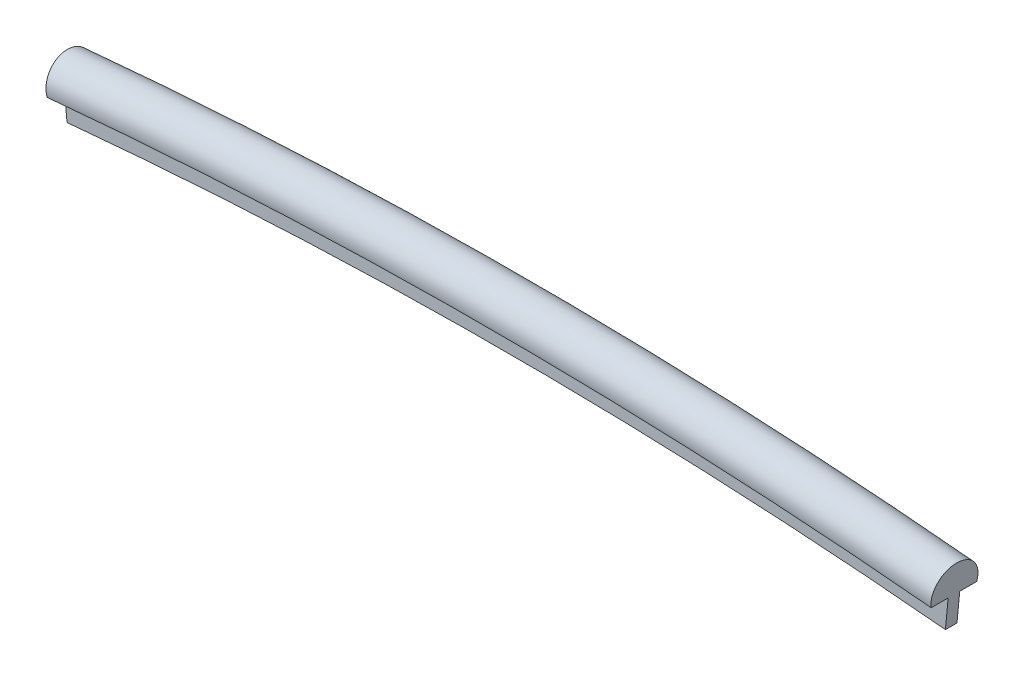
ISO-10303-21;
HEADER;
FILE_DESCRIPTION(('STEP AP214'),'2;1');
FILE_NAME('part.step','',(''),(''),'','','');
FILE_SCHEMA(('AUTOMOTIVE_DESIGN { 1 0 10303 214 1 1 1 1 }'));
ENDSEC;
DATA;
#1=APPLICATION_CONTEXT('core data for automotive mechanical design processes');
#2=APPLICATION_PROTOCOL_DEFINITION('international standard','automotive_design',2000,#1);
#3=PRODUCT_CONTEXT('',#1,'mechanical');
#4=PRODUCT('Part','Part','',(#3));
#5=PRODUCT_RELATED_PRODUCT_CATEGORY('part','',(#4));
#6=PRODUCT_DEFINITION_FORMATION('','',#4);
#7=PRODUCT_DEFINITION_CONTEXT('part definition',#1,'design');
#8=PRODUCT_DEFINITION('design','',#6,#7);
#9=PRODUCT_DEFINITION_SHAPE('','',#8);
#10=(LENGTH_UNIT() NAMED_UNIT(*) SI_UNIT(.MILLI.,.METRE.));
#11=(NAMED_UNIT(*) PLANE_ANGLE_UNIT() SI_UNIT($,.RADIAN.));
#12=(NAMED_UNIT(*) SI_UNIT($,.STERADIAN.) SOLID_ANGLE_UNIT());
#13=UNCERTAINTY_MEASURE_WITH_UNIT(LENGTH_MEASURE(1.E-05),#10,'distance_accuracy_value','');
#14=(GEOMETRIC_REPRESENTATION_CONTEXT(3) GLOBAL_UNCERTAINTY_ASSIGNED_CONTEXT((#13)) GLOBAL_UNIT_ASSIGNED_CONTEXT((#10,
#11,#12)) REPRESENTATION_CONTEXT('',''));
#15=CARTESIAN_POINT('',(0.,0.,0.));
#16=DIRECTION('',(0.,0.,1.));
#17=DIRECTION('',(1.,0.,0.));
#18=AXIS2_PLACEMENT_3D('',#15,#16,#17);
#19=CARTESIAN_POINT('',(0.,0.,70.5976415970385));
#20=DIRECTION('',(0.,0.,1.));
#21=DIRECTION('',(1.,0.,0.));
#22=AXIS2_PLACEMENT_3D('',#19,#20,#21);
#23=CYLINDRICAL_SURFACE('',#22,241.3);
#24=CARTESIAN_POINT('',(0.,0.,1.18));
#25=DIRECTION('',(0.,0.,1.));
#26=DIRECTION('',(1.,0.,0.));
#27=AXIS2_PLACEMENT_3D('',#24,#25,#26);
#28=CIRCLE('',#27,241.3);
#29=CARTESIAN_POINT('',(22.885569844404,240.21228256044,1.18));
#30=VERTEX_POINT('',#29);
#31=CARTESIAN_POINT('',(-22.885569844404,240.21228256044,1.18));
#32=VERTEX_POINT('',#31);
#33=EDGE_CURVE('E11',#30,#32,#28,.T.);
#34=ORIENTED_EDGE('',*,*,#33,.T.);
#35=DIRECTION('',(0.,0.,-1.));
#36=VECTOR('',#35,1.);
#37=CARTESIAN_POINT('',(-22.885569844404,240.21228256044,1.18));
#38=LINE('',#37,#36);
#39=CARTESIAN_POINT('',(-22.885569844404,240.21228256044,0.3));
#40=VERTEX_POINT('',#39);
#41=EDGE_CURVE('E103',#32,#40,#38,.T.);
#42=ORIENTED_EDGE('',*,*,#41,.T.);
#43=CARTESIAN_POINT('',(0.,0.,0.299999999999995));
#44=DIRECTION('',(0.,0.,1.));
#45=DIRECTION('',(1.,0.,0.));
#46=AXIS2_PLACEMENT_3D('',#43,#44,#45);
#47=CIRCLE('',#46,241.3);
#48=CARTESIAN_POINT('',(22.885569844404,240.21228256044,0.3));
#49=VERTEX_POINT('',#48);
#50=EDGE_CURVE('E85',#49,#40,#47,.T.);
#51=ORIENTED_EDGE('',*,*,#50,.F.);
#52=DIRECTION('',(0.,0.,-1.));
#53=VECTOR('',#52,1.);
#54=CARTESIAN_POINT('',(22.885569844404,240.21228256044,1.18));
#55=LINE('',#54,#53);
#56=EDGE_CURVE('E117',#30,#49,#55,.T.);
#57=ORIENTED_EDGE('',*,*,#56,.F.);
#58=EDGE_LOOP('',(#34,#42,#51,#57));
#59=FACE_BOUND('',#58,.T.);
#60=ADVANCED_FACE('F33',(#59),#23,.F.);
#61=CARTESIAN_POINT('',(0.,0.,0.));
#62=DIRECTION('',(0.,0.,1.));
#63=DIRECTION('',(1.,0.,0.));
#64=AXIS2_PLACEMENT_3D('',#61,#62,#63);
#65=TOROIDAL_SURFACE('',#64,241.586013989906,1.21416802890791);
#66=CARTESIAN_POINT('',(0.,0.,-1.18));
#67=DIRECTION('',(0.,0.,1.));
#68=DIRECTION('',(1.,0.,0.));
#69=AXIS2_PLACEMENT_3D('',#66,#67,#68);
#70=CIRCLE('',#69,241.3);
#71=CARTESIAN_POINT('',(22.885569844404,240.21228256044,-1.18));
#72=VERTEX_POINT('',#71);
#73=CARTESIAN_POINT('',(-22.885569844404,240.21228256044,-1.18));
#74=VERTEX_POINT('',#73);
#75=EDGE_CURVE('E41',#72,#74,#70,.T.);
#76=ORIENTED_EDGE('',*,*,#75,.T.);
#77=CARTESIAN_POINT('',(-22.9126962146588,240.497007273908,0.));
#78=DIRECTION('',(0.995492260921842,0.0948428091355327,0.));
#79=DIRECTION('',(0.,0.,1.));
#80=AXIS2_PLACEMENT_3D('',#77,#78,#79);
#81=CIRCLE('',#80,1.21416802890791);
#82=EDGE_CURVE('E115',#74,#32,#81,.T.);
#83=ORIENTED_EDGE('',*,*,#82,.T.);
#84=ORIENTED_EDGE('',*,*,#33,.F.);
#85=CARTESIAN_POINT('',(22.9126962146588,240.497007273908,0.));
#86=DIRECTION('',(0.995492260921842,-0.0948428091355327,0.));
#87=DIRECTION('',(0.,0.,1.));
#88=AXIS2_PLACEMENT_3D('',#85,#86,#87);
#89=CIRCLE('',#88,1.21416802890791);
#90=EDGE_CURVE('E97',#72,#30,#89,.T.);
#91=ORIENTED_EDGE('',*,*,#90,.F.);
#92=EDGE_LOOP('',(#76,#83,#84,#91));
#93=FACE_BOUND('',#92,.T.);
#94=ADVANCED_FACE('F35',(#93),#65,.T.);
#95=CARTESIAN_POINT('',(0.,0.,70.5976415970385));
#96=DIRECTION('',(0.,0.,1.));
#97=DIRECTION('',(1.,0.,0.));
#98=AXIS2_PLACEMENT_3D('',#95,#96,#97);
#99=CYLINDRICAL_SURFACE('',#98,241.3);
#100=CARTESIAN_POINT('',(0.,0.,-0.299999999999995));
#101=DIRECTION('',(0.,0.,1.));
#102=DIRECTION('',(1.,0.,0.));
#103=AXIS2_PLACEMENT_3D('',#100,#101,#102);
#104=CIRCLE('',#103,241.3);
#105=CARTESIAN_POINT('',(22.885569844404,240.21228256044,-0.3));
#106=VERTEX_POINT('',#105);
#107=CARTESIAN_POINT('',(-22.885569844404,240.21228256044,-0.3));
#108=VERTEX_POINT('',#107);
#109=EDGE_CURVE('E132',#106,#108,#104,.T.);
#110=ORIENTED_EDGE('',*,*,#109,.T.);
#111=DIRECTION('',(0.,0.,-1.));
#112=VECTOR('',#111,1.);
#113=CARTESIAN_POINT('',(-22.885569844404,240.21228256044,-0.3));
#114=LINE('',#113,#112);
#115=EDGE_CURVE('E113',#108,#74,#114,.T.);
#116=ORIENTED_EDGE('',*,*,#115,.T.);
#117=ORIENTED_EDGE('',*,*,#75,.F.);
#118=DIRECTION('',(0.,0.,-1.));
#119=VECTOR('',#118,1.);
#120=CARTESIAN_POINT('',(22.885569844404,240.21228256044,-0.3));
#121=LINE('',#120,#119);
#122=EDGE_CURVE('E125',#106,#72,#121,.T.);
#123=ORIENTED_EDGE('',*,*,#122,.F.);
#124=EDGE_LOOP('',(#110,#116,#117,#123));
#125=FACE_BOUND('',#124,.T.);
#126=ADVANCED_FACE('F134',(#125),#99,.F.);
#127=CARTESIAN_POINT('',(22.7433056307007,238.719044169058,-0.3));
#128=DIRECTION('',(0.,0.,1.));
#129=DIRECTION('',(1.,0.,0.));
#130=AXIS2_PLACEMENT_3D('',#127,#128,#129);
#131=PLANE('',#130);
#132=CARTESIAN_POINT('',(0.,0.,-0.299999999999995));
#133=DIRECTION('',(0.,0.,1.));
#134=DIRECTION('',(1.,0.,0.));
#135=AXIS2_PLACEMENT_3D('',#132,#133,#134);
#136=CIRCLE('',#135,239.8);
#137=CARTESIAN_POINT('',(22.7433056307007,238.719044169058,-0.3));
#138=VERTEX_POINT('',#137);
#139=CARTESIAN_POINT('',(-22.7433056307007,238.719044169058,-0.3));
#140=VERTEX_POINT('',#139);
#141=EDGE_CURVE('E129',#138,#140,#136,.T.);
#142=ORIENTED_EDGE('',*,*,#141,.T.);
#143=DIRECTION('',(-0.0948428091355327,0.995492260921842,0.));
#144=VECTOR('',#143,1.);
#145=CARTESIAN_POINT('',(-22.7433056307007,238.719044169058,-0.3));
#146=LINE('',#145,#144);
#147=EDGE_CURVE('E110',#140,#108,#146,.T.);
#148=ORIENTED_EDGE('',*,*,#147,.T.);
#149=ORIENTED_EDGE('',*,*,#109,.F.);
#150=DIRECTION('',(0.0948428091355327,0.995492260921842,0.));
#151=VECTOR('',#150,1.);
#152=CARTESIAN_POINT('',(22.7433056307007,238.719044169058,-0.3));
#153=LINE('',#152,#151);
#154=EDGE_CURVE('E122',#138,#106,#153,.T.);
#155=ORIENTED_EDGE('',*,*,#154,.F.);
#156=EDGE_LOOP('',(#142,#148,#149,#155));
#157=FACE_BOUND('',#156,.T.);
#158=ADVANCED_FACE('F136',(#157),#131,.F.);
#159=CARTESIAN_POINT('',(0.,0.,70.5976415970385));
#160=DIRECTION('',(0.,0.,1.));
#161=DIRECTION('',(1.,0.,0.));
#162=AXIS2_PLACEMENT_3D('',#159,#160,#161);
#163=CYLINDRICAL_SURFACE('',#162,239.8);
#164=CARTESIAN_POINT('',(0.,0.,0.299999999999995));
#165=DIRECTION('',(0.,0.,1.));
#166=DIRECTION('',(1.,0.,0.));
#167=AXIS2_PLACEMENT_3D('',#164,#165,#166);
#168=CIRCLE('',#167,239.8);
#169=CARTESIAN_POINT('',(22.7433056307007,238.719044169058,0.3));
#170=VERTEX_POINT('',#169);
#171=CARTESIAN_POINT('',(-22.7433056307007,238.719044169058,0.3));
#172=VERTEX_POINT('',#171);
#173=EDGE_CURVE('E96',#170,#172,#168,.T.);
#174=ORIENTED_EDGE('',*,*,#173,.T.);
#175=DIRECTION('',(0.,0.,-1.));
#176=VECTOR('',#175,1.);
#177=CARTESIAN_POINT('',(-22.7433056307007,238.719044169058,0.));
#178=LINE('',#177,#176);
#179=EDGE_CURVE('E105',#172,#140,#178,.T.);
#180=ORIENTED_EDGE('',*,*,#179,.T.);
#181=ORIENTED_EDGE('',*,*,#141,.F.);
#182=DIRECTION('',(0.,0.,-1.));
#183=VECTOR('',#182,1.);
#184=CARTESIAN_POINT('',(22.7433056307007,238.719044169058,0.));
#185=LINE('',#184,#183);
#186=EDGE_CURVE('E120',#170,#138,#185,.T.);
#187=ORIENTED_EDGE('',*,*,#186,.F.);
#188=EDGE_LOOP('',(#174,#180,#181,#187));
#189=FACE_BOUND('',#188,.T.);
#190=ADVANCED_FACE('F141',(#189),#163,.F.);
#191=CARTESIAN_POINT('',(22.7433056307007,238.719044169058,0.3));
#192=DIRECTION('',(0.,0.,-1.));
#193=DIRECTION('',(-1.,0.,0.));
#194=AXIS2_PLACEMENT_3D('',#191,#192,#193);
#195=PLANE('',#194);
#196=DIRECTION('',(-0.0948428091355327,-0.995492260921842,0.));
#197=VECTOR('',#196,1.);
#198=CARTESIAN_POINT('',(22.7433056307007,238.719044169058,0.3));
#199=LINE('',#198,#197);
#200=EDGE_CURVE('E91',#49,#170,#199,.T.);
#201=ORIENTED_EDGE('',*,*,#200,.F.);
#202=ORIENTED_EDGE('',*,*,#50,.T.);
#203=DIRECTION('',(0.0948428091355327,-0.995492260921842,0.));
#204=VECTOR('',#203,1.);
#205=CARTESIAN_POINT('',(-22.7433056307007,238.719044169058,0.3));
#206=LINE('',#205,#204);
#207=EDGE_CURVE('E88',#40,#172,#206,.T.);
#208=ORIENTED_EDGE('',*,*,#207,.T.);
#209=ORIENTED_EDGE('',*,*,#173,.F.);
#210=EDGE_LOOP('',(#201,#202,#208,#209));
#211=FACE_BOUND('',#210,.T.);
#212=ADVANCED_FACE('F87',(#211),#195,.F.);
#213=CARTESIAN_POINT('',(22.9126962146588,240.497007273908,0.));
#214=DIRECTION('',(-0.995492260921842,0.0948428091355327,0.));
#215=DIRECTION('',(0.,0.,1.));
#216=AXIS2_PLACEMENT_3D('',#213,#214,#215);
#217=PLANE('',#216);
#218=ORIENTED_EDGE('',*,*,#56,.T.);
#219=ORIENTED_EDGE('',*,*,#200,.T.);
#220=ORIENTED_EDGE('',*,*,#186,.T.);
#221=ORIENTED_EDGE('',*,*,#154,.T.);
#222=ORIENTED_EDGE('',*,*,#122,.T.);
#223=ORIENTED_EDGE('',*,*,#90,.T.);
#224=EDGE_LOOP('',(#218,#219,#220,#221,#222,#223));
#225=FACE_BOUND('',#224,.T.);
#226=ADVANCED_FACE('F143',(#225),#217,.F.);
#227=CARTESIAN_POINT('',(-22.9126962146588,240.497007273908,0.));
#228=DIRECTION('',(-0.995492260921842,-0.0948428091355327,0.));
#229=DIRECTION('',(0.,0.,1.));
#230=AXIS2_PLACEMENT_3D('',#227,#228,#229);
#231=PLANE('',#230);
#232=ORIENTED_EDGE('',*,*,#41,.F.);
#233=ORIENTED_EDGE('',*,*,#82,.F.);
#234=ORIENTED_EDGE('',*,*,#115,.F.);
#235=ORIENTED_EDGE('',*,*,#147,.F.);
#236=ORIENTED_EDGE('',*,*,#179,.F.);
#237=ORIENTED_EDGE('',*,*,#207,.F.);
#238=EDGE_LOOP('',(#232,#233,#234,#235,#236,#237));
#239=FACE_BOUND('',#238,.T.);
#240=ADVANCED_FACE('F101',(#239),#231,.T.);
#241=CLOSED_SHELL('',(#60,#94,#126,#158,#190,#212,#226,#240));
#242=MANIFOLD_SOLID_BREP('B2',#241);
#243=ADVANCED_BREP_SHAPE_REPRESENTATION('',(#18,#242),#14);
#244=SHAPE_DEFINITION_REPRESENTATION(#9,#243);
ENDSEC;
END-ISO-10303-21;
